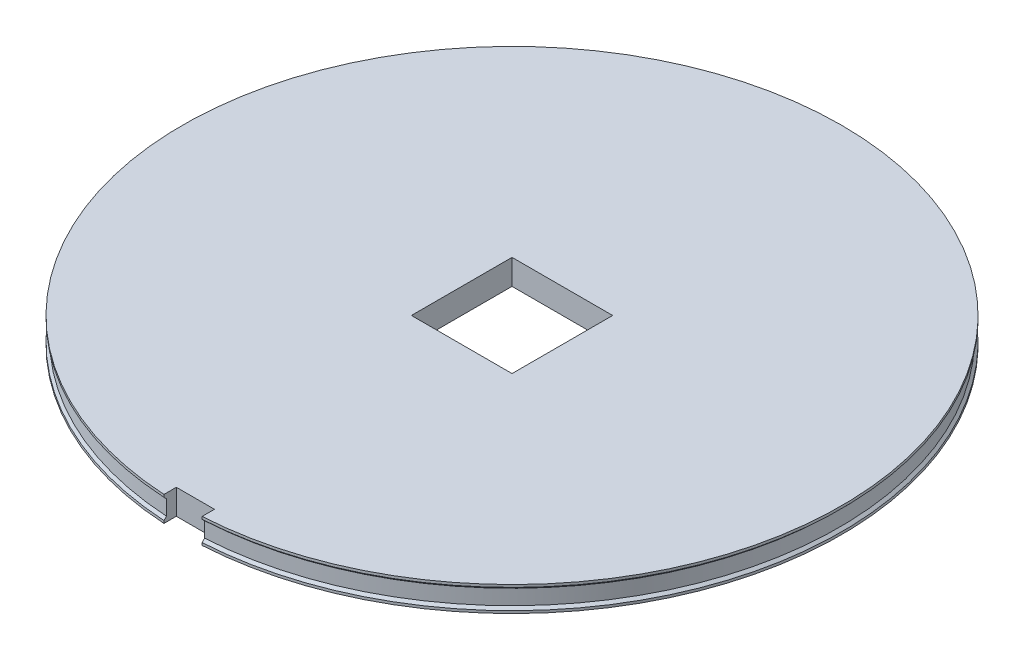
ISO-10303-21;
HEADER;
FILE_DESCRIPTION(('STEP AP214'),'2;1');
FILE_NAME('part.step','',(''),(''),'','','');
FILE_SCHEMA(('AUTOMOTIVE_DESIGN { 1 0 10303 214 1 1 1 1 }'));
ENDSEC;
DATA;
#1=APPLICATION_CONTEXT('core data for automotive mechanical design processes');
#2=APPLICATION_PROTOCOL_DEFINITION('international standard','automotive_design',2000,#1);
#3=PRODUCT_CONTEXT('',#1,'mechanical');
#4=PRODUCT('Part','Part','',(#3));
#5=PRODUCT_RELATED_PRODUCT_CATEGORY('part','',(#4));
#6=PRODUCT_DEFINITION_FORMATION('','',#4);
#7=PRODUCT_DEFINITION_CONTEXT('part definition',#1,'design');
#8=PRODUCT_DEFINITION('design','',#6,#7);
#9=PRODUCT_DEFINITION_SHAPE('','',#8);
#10=(LENGTH_UNIT() NAMED_UNIT(*) SI_UNIT(.MILLI.,.METRE.));
#11=(NAMED_UNIT(*) PLANE_ANGLE_UNIT() SI_UNIT($,.RADIAN.));
#12=(NAMED_UNIT(*) SI_UNIT($,.STERADIAN.) SOLID_ANGLE_UNIT());
#13=UNCERTAINTY_MEASURE_WITH_UNIT(LENGTH_MEASURE(1.E-05),#10,'distance_accuracy_value','');
#14=(GEOMETRIC_REPRESENTATION_CONTEXT(3) GLOBAL_UNCERTAINTY_ASSIGNED_CONTEXT((#13)) GLOBAL_UNIT_ASSIGNED_CONTEXT((#10,
#11,#12)) REPRESENTATION_CONTEXT('',''));
#15=CARTESIAN_POINT('',(0.,0.,0.));
#16=DIRECTION('',(0.,0.,1.));
#17=DIRECTION('',(1.,0.,0.));
#18=AXIS2_PLACEMENT_3D('',#15,#16,#17);
#19=CARTESIAN_POINT('',(0.,10.,0.));
#20=DIRECTION('',(0.,-1.,0.));
#21=DIRECTION('',(0.,0.,-1.));
#22=AXIS2_PLACEMENT_3D('',#19,#20,#21);
#23=CYLINDRICAL_SURFACE('',#22,131.);
#24=DIRECTION('',(0.,-1.,0.));
#25=VECTOR('',#24,1.);
#26=CARTESIAN_POINT('',(-7.58071445300379,10.,130.780475486144));
#27=LINE('',#26,#25);
#28=CARTESIAN_POINT('',(-7.58071445300379,1.00000000000003,130.780475486144));
#29=VERTEX_POINT('',#28);
#30=CARTESIAN_POINT('',(-7.58071445300379,0.,130.780475486144));
#31=VERTEX_POINT('',#30);
#32=EDGE_CURVE('E224',#29,#31,#27,.T.);
#33=ORIENTED_EDGE('',*,*,#32,.F.);
#34=CARTESIAN_POINT('',(0.,1.00000000000003,0.));
#35=DIRECTION('',(0.,-1.,0.));
#36=DIRECTION('',(0.,0.,-1.));
#37=AXIS2_PLACEMENT_3D('',#34,#35,#36);
#38=CIRCLE('',#37,131.);
#39=CARTESIAN_POINT('',(7.58071445300379,1.00000000000003,130.780475486144));
#40=VERTEX_POINT('',#39);
#41=EDGE_CURVE('E141',#29,#40,#38,.T.);
#42=ORIENTED_EDGE('',*,*,#41,.T.);
#43=DIRECTION('',(0.,-1.,0.));
#44=VECTOR('',#43,1.);
#45=CARTESIAN_POINT('',(7.58071445300379,10.,130.780475486144));
#46=LINE('',#45,#44);
#47=CARTESIAN_POINT('',(7.58071445300379,0.,130.780475486144));
#48=VERTEX_POINT('',#47);
#49=EDGE_CURVE('E294',#48,#40,#46,.F.);
#50=ORIENTED_EDGE('',*,*,#49,.F.);
#51=CARTESIAN_POINT('',(0.,0.,0.));
#52=DIRECTION('',(0.,1.,0.));
#53=DIRECTION('',(0.,0.,1.));
#54=AXIS2_PLACEMENT_3D('',#51,#52,#53);
#55=CIRCLE('',#54,131.);
#56=EDGE_CURVE('E228',#48,#31,#55,.T.);
#57=ORIENTED_EDGE('',*,*,#56,.T.);
#58=EDGE_LOOP('',(#33,#42,#50,#57));
#59=FACE_BOUND('',#58,.T.);
#60=ADVANCED_FACE('F36',(#59),#23,.T.);
#61=CARTESIAN_POINT('',(0.,10.,0.));
#62=DIRECTION('',(0.,1.,0.));
#63=DIRECTION('',(0.,0.,1.));
#64=AXIS2_PLACEMENT_3D('',#61,#62,#63);
#65=PLANE('',#64);
#66=DIRECTION('',(-1.,0.,0.));
#67=VECTOR('',#66,1.);
#68=CARTESIAN_POINT('',(-20.,10.,-20.));
#69=LINE('',#68,#67);
#70=CARTESIAN_POINT('',(20.,10.,-20.));
#71=VERTEX_POINT('',#70);
#72=CARTESIAN_POINT('',(-20.,10.,-20.));
#73=VERTEX_POINT('',#72);
#74=EDGE_CURVE('E259',#71,#73,#69,.T.);
#75=ORIENTED_EDGE('',*,*,#74,.F.);
#76=DIRECTION('',(0.,0.,-1.));
#77=VECTOR('',#76,1.);
#78=CARTESIAN_POINT('',(20.,10.,20.));
#79=LINE('',#78,#77);
#80=CARTESIAN_POINT('',(20.,10.,20.));
#81=VERTEX_POINT('',#80);
#82=EDGE_CURVE('E257',#81,#71,#79,.T.);
#83=ORIENTED_EDGE('',*,*,#82,.F.);
#84=DIRECTION('',(1.,0.,0.));
#85=VECTOR('',#84,1.);
#86=CARTESIAN_POINT('',(-20.,10.,20.));
#87=LINE('',#86,#85);
#88=CARTESIAN_POINT('',(-20.,10.,20.));
#89=VERTEX_POINT('',#88);
#90=EDGE_CURVE('E265',#89,#81,#87,.T.);
#91=ORIENTED_EDGE('',*,*,#90,.F.);
#92=DIRECTION('',(0.,0.,1.));
#93=VECTOR('',#92,1.);
#94=CARTESIAN_POINT('',(-20.,10.,20.));
#95=LINE('',#94,#93);
#96=EDGE_CURVE('E262',#73,#89,#95,.T.);
#97=ORIENTED_EDGE('',*,*,#96,.F.);
#98=EDGE_LOOP('',(#75,#83,#91,#97));
#99=FACE_BOUND('',#98,.T.);
#100=DIRECTION('',(-1.,0.,0.));
#101=VECTOR('',#100,1.);
#102=CARTESIAN_POINT('',(-7.58071445300379,10.,125.867820007809));
#103=LINE('',#102,#101);
#104=CARTESIAN_POINT('',(7.58071445300379,10.,125.867820007809));
#105=VERTEX_POINT('',#104);
#106=CARTESIAN_POINT('',(-7.58071445300379,10.,125.867820007809));
#107=VERTEX_POINT('',#106);
#108=EDGE_CURVE('E239',#105,#107,#103,.T.);
#109=ORIENTED_EDGE('',*,*,#108,.F.);
#110=DIRECTION('',(0.,0.,-1.));
#111=VECTOR('',#110,1.);
#112=CARTESIAN_POINT('',(7.58071445300379,10.,125.867820007809));
#113=LINE('',#112,#111);
#114=CARTESIAN_POINT('',(7.58071445300379,10.,130.780475486144));
#115=VERTEX_POINT('',#114);
#116=EDGE_CURVE('E237',#115,#105,#113,.T.);
#117=ORIENTED_EDGE('',*,*,#116,.F.);
#118=CARTESIAN_POINT('',(0.,10.,0.));
#119=DIRECTION('',(0.,1.,0.));
#120=DIRECTION('',(0.,0.,1.));
#121=AXIS2_PLACEMENT_3D('',#118,#119,#120);
#122=CIRCLE('',#121,131.);
#123=CARTESIAN_POINT('',(-7.58071445300379,10.,130.780475486144));
#124=VERTEX_POINT('',#123);
#125=EDGE_CURVE('E232',#115,#124,#122,.T.);
#126=ORIENTED_EDGE('',*,*,#125,.T.);
#127=DIRECTION('',(0.,0.,1.));
#128=VECTOR('',#127,1.);
#129=CARTESIAN_POINT('',(-7.58071445300379,10.,125.867820007809));
#130=LINE('',#129,#128);
#131=EDGE_CURVE('E242',#107,#124,#130,.T.);
#132=ORIENTED_EDGE('',*,*,#131,.F.);
#133=EDGE_LOOP('',(#109,#117,#126,#132));
#134=FACE_BOUND('',#133,.T.);
#135=ADVANCED_FACE('F182',(#99,#134),#65,.T.);
#136=CARTESIAN_POINT('',(0.,0.,0.));
#137=DIRECTION('',(0.,1.,0.));
#138=DIRECTION('',(0.,0.,1.));
#139=AXIS2_PLACEMENT_3D('',#136,#137,#138);
#140=PLANE('',#139);
#141=DIRECTION('',(0.,0.,-1.));
#142=VECTOR('',#141,1.);
#143=CARTESIAN_POINT('',(20.,0.,20.));
#144=LINE('',#143,#142);
#145=CARTESIAN_POINT('',(20.,0.,20.));
#146=VERTEX_POINT('',#145);
#147=CARTESIAN_POINT('',(20.,0.,-20.));
#148=VERTEX_POINT('',#147);
#149=EDGE_CURVE('E256',#146,#148,#144,.T.);
#150=ORIENTED_EDGE('',*,*,#149,.T.);
#151=DIRECTION('',(-1.,0.,0.));
#152=VECTOR('',#151,1.);
#153=CARTESIAN_POINT('',(-20.,0.,-20.));
#154=LINE('',#153,#152);
#155=CARTESIAN_POINT('',(-20.,0.,-20.));
#156=VERTEX_POINT('',#155);
#157=EDGE_CURVE('E270',#148,#156,#154,.T.);
#158=ORIENTED_EDGE('',*,*,#157,.T.);
#159=DIRECTION('',(0.,0.,1.));
#160=VECTOR('',#159,1.);
#161=CARTESIAN_POINT('',(-20.,0.,20.));
#162=LINE('',#161,#160);
#163=CARTESIAN_POINT('',(-20.,0.,20.));
#164=VERTEX_POINT('',#163);
#165=EDGE_CURVE('E273',#156,#164,#162,.T.);
#166=ORIENTED_EDGE('',*,*,#165,.T.);
#167=DIRECTION('',(1.,0.,0.));
#168=VECTOR('',#167,1.);
#169=CARTESIAN_POINT('',(-20.,0.,20.));
#170=LINE('',#169,#168);
#171=EDGE_CURVE('E260',#164,#146,#170,.T.);
#172=ORIENTED_EDGE('',*,*,#171,.T.);
#173=EDGE_LOOP('',(#150,#158,#166,#172));
#174=FACE_BOUND('',#173,.T.);
#175=DIRECTION('',(0.,0.,-1.));
#176=VECTOR('',#175,1.);
#177=CARTESIAN_POINT('',(7.58071445300379,0.,125.867820007809));
#178=LINE('',#177,#176);
#179=CARTESIAN_POINT('',(7.58071445300379,0.,125.867820007809));
#180=VERTEX_POINT('',#179);
#181=EDGE_CURVE('E139',#48,#180,#178,.T.);
#182=ORIENTED_EDGE('',*,*,#181,.T.);
#183=DIRECTION('',(-1.,0.,0.));
#184=VECTOR('',#183,1.);
#185=CARTESIAN_POINT('',(-7.58071445300379,0.,125.867820007809));
#186=LINE('',#185,#184);
#187=CARTESIAN_POINT('',(-7.58071445300379,0.,125.867820007809));
#188=VERTEX_POINT('',#187);
#189=EDGE_CURVE('E247',#180,#188,#186,.T.);
#190=ORIENTED_EDGE('',*,*,#189,.T.);
#191=DIRECTION('',(0.,0.,1.));
#192=VECTOR('',#191,1.);
#193=CARTESIAN_POINT('',(-7.58071445300379,0.,125.867820007809));
#194=LINE('',#193,#192);
#195=EDGE_CURVE('E240',#188,#31,#194,.T.);
#196=ORIENTED_EDGE('',*,*,#195,.T.);
#197=ORIENTED_EDGE('',*,*,#56,.F.);
#198=EDGE_LOOP('',(#182,#190,#196,#197));
#199=FACE_BOUND('',#198,.T.);
#200=ADVANCED_FACE('F185',(#174,#199),#140,.F.);
#201=CARTESIAN_POINT('',(7.58071445300379,9.,130.780475486144));
#202=VERTEX_POINT('',#201);
#203=EDGE_CURVE('E293',#202,#115,#46,.F.);
#204=ORIENTED_EDGE('',*,*,#203,.F.);
#205=CARTESIAN_POINT('',(0.,9.,0.));
#206=DIRECTION('',(0.,1.,0.));
#207=DIRECTION('',(0.,0.,1.));
#208=AXIS2_PLACEMENT_3D('',#205,#206,#207);
#209=CIRCLE('',#208,131.);
#210=CARTESIAN_POINT('',(-7.58071445300379,9.,130.780475486144));
#211=VERTEX_POINT('',#210);
#212=EDGE_CURVE('E11',#202,#211,#209,.T.);
#213=ORIENTED_EDGE('',*,*,#212,.T.);
#214=EDGE_CURVE('E231',#124,#211,#27,.T.);
#215=ORIENTED_EDGE('',*,*,#214,.F.);
#216=ORIENTED_EDGE('',*,*,#125,.F.);
#217=EDGE_LOOP('',(#204,#213,#215,#216));
#218=FACE_BOUND('',#217,.T.);
#219=ADVANCED_FACE('F180',(#218),#23,.T.);
#220=CARTESIAN_POINT('',(20.,10.,20.));
#221=DIRECTION('',(-1.,0.,0.));
#222=DIRECTION('',(0.,0.,1.));
#223=AXIS2_PLACEMENT_3D('',#220,#221,#222);
#224=PLANE('',#223);
#225=ORIENTED_EDGE('',*,*,#149,.F.);
#226=DIRECTION('',(0.,-1.,0.));
#227=VECTOR('',#226,1.);
#228=CARTESIAN_POINT('',(20.,10.,20.));
#229=LINE('',#228,#227);
#230=EDGE_CURVE('E267',#81,#146,#229,.T.);
#231=ORIENTED_EDGE('',*,*,#230,.F.);
#232=ORIENTED_EDGE('',*,*,#82,.T.);
#233=DIRECTION('',(0.,-1.,0.));
#234=VECTOR('',#233,1.);
#235=CARTESIAN_POINT('',(20.,10.,-20.));
#236=LINE('',#235,#234);
#237=EDGE_CURVE('E284',#71,#148,#236,.T.);
#238=ORIENTED_EDGE('',*,*,#237,.T.);
#239=EDGE_LOOP('',(#225,#231,#232,#238));
#240=FACE_BOUND('',#239,.T.);
#241=ADVANCED_FACE('F176',(#240),#224,.T.);
#242=CARTESIAN_POINT('',(-20.,10.,-20.));
#243=DIRECTION('',(0.,0.,1.));
#244=DIRECTION('',(1.,0.,0.));
#245=AXIS2_PLACEMENT_3D('',#242,#243,#244);
#246=PLANE('',#245);
#247=ORIENTED_EDGE('',*,*,#157,.F.);
#248=ORIENTED_EDGE('',*,*,#237,.F.);
#249=ORIENTED_EDGE('',*,*,#74,.T.);
#250=DIRECTION('',(0.,-1.,0.));
#251=VECTOR('',#250,1.);
#252=CARTESIAN_POINT('',(-20.,10.,-20.));
#253=LINE('',#252,#251);
#254=EDGE_CURVE('E282',#73,#156,#253,.T.);
#255=ORIENTED_EDGE('',*,*,#254,.T.);
#256=EDGE_LOOP('',(#247,#248,#249,#255));
#257=FACE_BOUND('',#256,.T.);
#258=ADVANCED_FACE('F172',(#257),#246,.T.);
#259=CARTESIAN_POINT('',(-20.,10.,20.));
#260=DIRECTION('',(1.,0.,0.));
#261=DIRECTION('',(0.,0.,-1.));
#262=AXIS2_PLACEMENT_3D('',#259,#260,#261);
#263=PLANE('',#262);
#264=ORIENTED_EDGE('',*,*,#165,.F.);
#265=ORIENTED_EDGE('',*,*,#254,.F.);
#266=ORIENTED_EDGE('',*,*,#96,.T.);
#267=DIRECTION('',(0.,-1.,0.));
#268=VECTOR('',#267,1.);
#269=CARTESIAN_POINT('',(-20.,10.,20.));
#270=LINE('',#269,#268);
#271=EDGE_CURVE('E280',#89,#164,#270,.T.);
#272=ORIENTED_EDGE('',*,*,#271,.T.);
#273=EDGE_LOOP('',(#264,#265,#266,#272));
#274=FACE_BOUND('',#273,.T.);
#275=ADVANCED_FACE('F168',(#274),#263,.T.);
#276=CARTESIAN_POINT('',(-20.,10.,20.));
#277=DIRECTION('',(0.,0.,-1.));
#278=DIRECTION('',(-1.,0.,0.));
#279=AXIS2_PLACEMENT_3D('',#276,#277,#278);
#280=PLANE('',#279);
#281=ORIENTED_EDGE('',*,*,#171,.F.);
#282=ORIENTED_EDGE('',*,*,#271,.F.);
#283=ORIENTED_EDGE('',*,*,#90,.T.);
#284=ORIENTED_EDGE('',*,*,#230,.T.);
#285=EDGE_LOOP('',(#281,#282,#283,#284));
#286=FACE_BOUND('',#285,.T.);
#287=ADVANCED_FACE('F162',(#286),#280,.T.);
#288=CARTESIAN_POINT('',(7.58071445300379,10.,125.867820007809));
#289=DIRECTION('',(-1.,0.,0.));
#290=DIRECTION('',(0.,0.,1.));
#291=AXIS2_PLACEMENT_3D('',#288,#289,#290);
#292=PLANE('',#291);
#293=ORIENTED_EDGE('',*,*,#49,.T.);
#294=CARTESIAN_POINT('',(7.58071445300379,1.00000000000003,130.780475486144));
#295=CARTESIAN_POINT('',(7.58071445300379,1.16666774955898,130.613527980959));
#296=CARTESIAN_POINT('',(7.58071445300379,1.33333495767179,130.446579935242));
#297=CARTESIAN_POINT('',(7.58071445300379,1.66666829100511,130.112682762745));
#298=CARTESIAN_POINT('',(7.58071445300379,1.83333441622563,129.945733635964));
#299=CARTESIAN_POINT('',(7.58071445300379,2.,129.778783968652));
#300=B_SPLINE_CURVE_WITH_KNOTS('',3,(#294,#295,#296,#297,#298,#299),.UNSPECIFIED.,.F.,.F.,(4,2,
4),(0.,0.707705075620713,1.4154101512415),.UNSPECIFIED.);
#301=CARTESIAN_POINT('',(7.58071445300379,2.,129.778783968652));
#302=VERTEX_POINT('',#301);
#303=EDGE_CURVE('E138',#40,#302,#300,.T.);
#304=ORIENTED_EDGE('',*,*,#303,.T.);
#305=DIRECTION('',(0.,-1.,0.));
#306=VECTOR('',#305,1.);
#307=CARTESIAN_POINT('',(7.58071445300379,0.,129.778783968652));
#308=LINE('',#307,#306);
#309=CARTESIAN_POINT('',(7.58071445300379,8.,129.778783968652));
#310=VERTEX_POINT('',#309);
#311=EDGE_CURVE('E130',#310,#302,#308,.T.);
#312=ORIENTED_EDGE('',*,*,#311,.F.);
#313=CARTESIAN_POINT('',(7.58071445300379,8.,129.778783968652));
#314=CARTESIAN_POINT('',(7.58071445300379,8.16666558377438,129.945733635964));
#315=CARTESIAN_POINT('',(7.58071445300379,8.3333317089949,130.112682762745));
#316=CARTESIAN_POINT('',(7.58071445300379,8.66666504232823,130.446579935242));
#317=CARTESIAN_POINT('',(7.58071445300379,8.83333225044104,130.613527980959));
#318=CARTESIAN_POINT('',(7.58071445300379,8.99999999999999,130.780475486144));
#319=B_SPLINE_CURVE_WITH_KNOTS('',3,(#313,#314,#315,#316,#317,#318),.UNSPECIFIED.,.F.,.F.,(4,2,
4),(0.,0.707705075620796,1.41541015124155),.UNSPECIFIED.);
#320=EDGE_CURVE('E60',#310,#202,#319,.T.);
#321=ORIENTED_EDGE('',*,*,#320,.T.);
#322=ORIENTED_EDGE('',*,*,#203,.T.);
#323=ORIENTED_EDGE('',*,*,#116,.T.);
#324=DIRECTION('',(0.,-1.,0.));
#325=VECTOR('',#324,1.);
#326=CARTESIAN_POINT('',(7.58071445300379,10.,125.867820007809));
#327=LINE('',#326,#325);
#328=EDGE_CURVE('E253',#105,#180,#327,.T.);
#329=ORIENTED_EDGE('',*,*,#328,.T.);
#330=ORIENTED_EDGE('',*,*,#181,.F.);
#331=EDGE_LOOP('',(#293,#304,#312,#321,#322,#323,#329,#330));
#332=FACE_BOUND('',#331,.T.);
#333=ADVANCED_FACE('F137',(#332),#292,.T.);
#334=CARTESIAN_POINT('',(-7.58071445300379,10.,125.867820007809));
#335=DIRECTION('',(1.,0.,0.));
#336=DIRECTION('',(0.,0.,-1.));
#337=AXIS2_PLACEMENT_3D('',#334,#335,#336);
#338=PLANE('',#337);
#339=DIRECTION('',(0.,-1.,0.));
#340=VECTOR('',#339,1.);
#341=CARTESIAN_POINT('',(-7.58071445300379,0.,129.778783968652));
#342=LINE('',#341,#340);
#343=CARTESIAN_POINT('',(-7.58071445300379,2.,129.778783968652));
#344=VERTEX_POINT('',#343);
#345=CARTESIAN_POINT('',(-7.58071445300379,8.,129.778783968652));
#346=VERTEX_POINT('',#345);
#347=EDGE_CURVE('E133',#344,#346,#342,.F.);
#348=ORIENTED_EDGE('',*,*,#347,.F.);
#349=CARTESIAN_POINT('',(-7.58071445300379,2.,129.778783968652));
#350=CARTESIAN_POINT('',(-7.58071445300379,1.83333441622563,129.945733635964));
#351=CARTESIAN_POINT('',(-7.58071445300379,1.66666829100511,130.112682762745));
#352=CARTESIAN_POINT('',(-7.58071445300379,1.33333495767179,130.446579935242));
#353=CARTESIAN_POINT('',(-7.58071445300379,1.16666774955899,130.613527980959));
#354=CARTESIAN_POINT('',(-7.58071445300379,1.00000000000003,130.780475486144));
#355=B_SPLINE_CURVE_WITH_KNOTS('',3,(#349,#350,#351,#352,#353,#354),.UNSPECIFIED.,.F.,.F.,(4,2,
4),(0.,0.707705075620786,1.4154101512415),.UNSPECIFIED.);
#356=EDGE_CURVE('E46',#344,#29,#355,.T.);
#357=ORIENTED_EDGE('',*,*,#356,.T.);
#358=ORIENTED_EDGE('',*,*,#32,.T.);
#359=ORIENTED_EDGE('',*,*,#195,.F.);
#360=DIRECTION('',(0.,-1.,0.));
#361=VECTOR('',#360,1.);
#362=CARTESIAN_POINT('',(-7.58071445300379,10.,125.867820007809));
#363=LINE('',#362,#361);
#364=EDGE_CURVE('E244',#107,#188,#363,.T.);
#365=ORIENTED_EDGE('',*,*,#364,.F.);
#366=ORIENTED_EDGE('',*,*,#131,.T.);
#367=ORIENTED_EDGE('',*,*,#214,.T.);
#368=CARTESIAN_POINT('',(-7.58071445300379,9.,130.780475486144));
#369=CARTESIAN_POINT('',(-7.58071445300379,8.83333225044104,130.613527980959));
#370=CARTESIAN_POINT('',(-7.58071445300379,8.66666504232823,130.446579935242));
#371=CARTESIAN_POINT('',(-7.58071445300379,8.3333317089949,130.112682762745));
#372=CARTESIAN_POINT('',(-7.58071445300379,8.16666558377437,129.945733635964));
#373=CARTESIAN_POINT('',(-7.58071445300379,8.,129.778783968652));
#374=B_SPLINE_CURVE_WITH_KNOTS('',3,(#368,#369,#370,#371,#372,#373),.UNSPECIFIED.,.F.,.F.,(4,2,
4),(0.,0.707705075620742,1.41541015124156),.UNSPECIFIED.);
#375=EDGE_CURVE('E53',#211,#346,#374,.T.);
#376=ORIENTED_EDGE('',*,*,#375,.T.);
#377=EDGE_LOOP('',(#348,#357,#358,#359,#365,#366,#367,#376));
#378=FACE_BOUND('',#377,.T.);
#379=ADVANCED_FACE('F161',(#378),#338,.T.);
#380=CARTESIAN_POINT('',(-7.58071445300379,10.,125.867820007809));
#381=DIRECTION('',(0.,0.,1.));
#382=DIRECTION('',(1.,0.,0.));
#383=AXIS2_PLACEMENT_3D('',#380,#381,#382);
#384=PLANE('',#383);
#385=ORIENTED_EDGE('',*,*,#189,.F.);
#386=ORIENTED_EDGE('',*,*,#328,.F.);
#387=ORIENTED_EDGE('',*,*,#108,.T.);
#388=ORIENTED_EDGE('',*,*,#364,.T.);
#389=EDGE_LOOP('',(#385,#386,#387,#388));
#390=FACE_BOUND('',#389,.T.);
#391=ADVANCED_FACE('F163',(#390),#384,.T.);
#392=CARTESIAN_POINT('',(0.,0.,0.));
#393=DIRECTION('',(0.,-1.,0.));
#394=DIRECTION('',(0.,0.,-1.));
#395=AXIS2_PLACEMENT_3D('',#392,#393,#394);
#396=CYLINDRICAL_SURFACE('',#395,130.);
#397=ORIENTED_EDGE('',*,*,#311,.T.);
#398=CARTESIAN_POINT('',(0.,2.,0.));
#399=DIRECTION('',(0.,-1.,0.));
#400=DIRECTION('',(0.,0.,-1.));
#401=AXIS2_PLACEMENT_3D('',#398,#399,#400);
#402=CIRCLE('',#401,130.);
#403=EDGE_CURVE('E134',#344,#302,#402,.T.);
#404=ORIENTED_EDGE('',*,*,#403,.F.);
#405=ORIENTED_EDGE('',*,*,#347,.T.);
#406=CARTESIAN_POINT('',(0.,8.,0.));
#407=DIRECTION('',(0.,-1.,0.));
#408=DIRECTION('',(0.,0.,-1.));
#409=AXIS2_PLACEMENT_3D('',#406,#407,#408);
#410=CIRCLE('',#409,130.);
#411=EDGE_CURVE('E128',#346,#310,#410,.T.);
#412=ORIENTED_EDGE('',*,*,#411,.T.);
#413=EDGE_LOOP('',(#397,#404,#405,#412));
#414=FACE_BOUND('',#413,.T.);
#415=ADVANCED_FACE('F129',(#414),#396,.T.);
#416=CARTESIAN_POINT('',(0.,1.00000000000003,0.));
#417=DIRECTION('',(0.,-1.,0.));
#418=DIRECTION('',(0.,0.,-1.));
#419=AXIS2_PLACEMENT_3D('',#416,#417,#418);
#420=CONICAL_SURFACE('',#419,131.,0.785398163397462);
#421=ORIENTED_EDGE('',*,*,#356,.F.);
#422=ORIENTED_EDGE('',*,*,#403,.T.);
#423=ORIENTED_EDGE('',*,*,#303,.F.);
#424=ORIENTED_EDGE('',*,*,#41,.F.);
#425=EDGE_LOOP('',(#421,#422,#423,#424));
#426=FACE_BOUND('',#425,.T.);
#427=ADVANCED_FACE('F193',(#426),#420,.T.);
#428=CARTESIAN_POINT('',(0.,9.,0.));
#429=DIRECTION('',(0.,1.,0.));
#430=DIRECTION('',(0.,0.,1.));
#431=AXIS2_PLACEMENT_3D('',#428,#429,#430);
#432=CONICAL_SURFACE('',#431,131.,0.785398163397476);
#433=ORIENTED_EDGE('',*,*,#320,.F.);
#434=ORIENTED_EDGE('',*,*,#411,.F.);
#435=ORIENTED_EDGE('',*,*,#375,.F.);
#436=ORIENTED_EDGE('',*,*,#212,.F.);
#437=EDGE_LOOP('',(#433,#434,#435,#436));
#438=FACE_BOUND('',#437,.T.);
#439=ADVANCED_FACE('F39',(#438),#432,.T.);
#440=CLOSED_SHELL('',(#60,#135,#200,#219,#241,#258,#275,#287,#333,#379,#391,#415,#427,#439));
#441=MANIFOLD_SOLID_BREP('B2',#440);
#442=ADVANCED_BREP_SHAPE_REPRESENTATION('',(#18,#441),#14);
#443=SHAPE_DEFINITION_REPRESENTATION(#9,#442);
ENDSEC;
END-ISO-10303-21;
